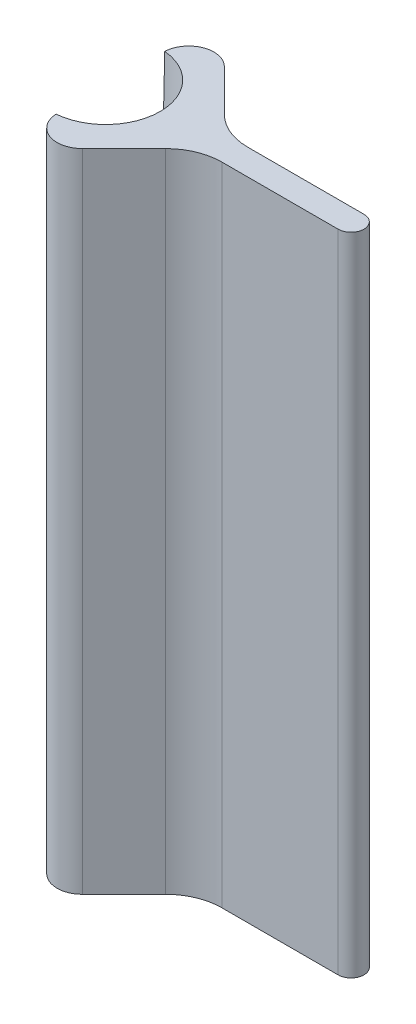
ISO-10303-21;
HEADER;
FILE_DESCRIPTION(('STEP AP214'),'2;1');
FILE_NAME('part.step','',(''),(''),'','','');
FILE_SCHEMA(('AUTOMOTIVE_DESIGN { 1 0 10303 214 1 1 1 1 }'));
ENDSEC;
DATA;
#1=APPLICATION_CONTEXT('core data for automotive mechanical design processes');
#2=APPLICATION_PROTOCOL_DEFINITION('international standard','automotive_design',2000,#1);
#3=PRODUCT_CONTEXT('',#1,'mechanical');
#4=PRODUCT('Part','Part','',(#3));
#5=PRODUCT_RELATED_PRODUCT_CATEGORY('part','',(#4));
#6=PRODUCT_DEFINITION_FORMATION('','',#4);
#7=PRODUCT_DEFINITION_CONTEXT('part definition',#1,'design');
#8=PRODUCT_DEFINITION('design','',#6,#7);
#9=PRODUCT_DEFINITION_SHAPE('','',#8);
#10=(LENGTH_UNIT() NAMED_UNIT(*) SI_UNIT(.MILLI.,.METRE.));
#11=(NAMED_UNIT(*) PLANE_ANGLE_UNIT() SI_UNIT($,.RADIAN.));
#12=(NAMED_UNIT(*) SI_UNIT($,.STERADIAN.) SOLID_ANGLE_UNIT());
#13=UNCERTAINTY_MEASURE_WITH_UNIT(LENGTH_MEASURE(1.E-05),#10,'distance_accuracy_value','');
#14=(GEOMETRIC_REPRESENTATION_CONTEXT(3) GLOBAL_UNCERTAINTY_ASSIGNED_CONTEXT((#13)) GLOBAL_UNIT_ASSIGNED_CONTEXT((#10,
#11,#12)) REPRESENTATION_CONTEXT('',''));
#15=CARTESIAN_POINT('',(0.,0.,0.));
#16=DIRECTION('',(0.,0.,1.));
#17=DIRECTION('',(1.,0.,0.));
#18=AXIS2_PLACEMENT_3D('',#15,#16,#17);
#19=CARTESIAN_POINT('',(3.8,10.,0.));
#20=DIRECTION('',(0.,-1.,0.));
#21=DIRECTION('',(0.,0.,-1.));
#22=AXIS2_PLACEMENT_3D('',#19,#20,#21);
#23=CYLINDRICAL_SURFACE('',#22,0.2);
#24=CARTESIAN_POINT('',(3.8,0.,0.));
#25=DIRECTION('',(0.,1.,0.));
#26=DIRECTION('',(0.,0.,1.));
#27=AXIS2_PLACEMENT_3D('',#24,#25,#26);
#28=CIRCLE('',#27,0.2);
#29=CARTESIAN_POINT('',(3.8,0.,-0.2));
#30=VERTEX_POINT('',#29);
#31=CARTESIAN_POINT('',(3.8,0.,0.2));
#32=VERTEX_POINT('',#31);
#33=EDGE_CURVE('E152',#30,#32,#28,.F.);
#34=ORIENTED_EDGE('',*,*,#33,.F.);
#35=DIRECTION('',(0.,-1.,0.));
#36=VECTOR('',#35,1.);
#37=CARTESIAN_POINT('',(3.8,10.,-0.2));
#38=LINE('',#37,#36);
#39=CARTESIAN_POINT('',(3.8,10.,-0.2));
#40=VERTEX_POINT('',#39);
#41=EDGE_CURVE('E11',#40,#30,#38,.T.);
#42=ORIENTED_EDGE('',*,*,#41,.F.);
#43=CARTESIAN_POINT('',(3.8,10.,0.));
#44=DIRECTION('',(0.,1.,0.));
#45=DIRECTION('',(0.,0.,1.));
#46=AXIS2_PLACEMENT_3D('',#43,#44,#45);
#47=CIRCLE('',#46,0.2);
#48=CARTESIAN_POINT('',(3.8,10.,0.2));
#49=VERTEX_POINT('',#48);
#50=EDGE_CURVE('E179',#40,#49,#47,.F.);
#51=ORIENTED_EDGE('',*,*,#50,.T.);
#52=DIRECTION('',(0.,-1.,0.));
#53=VECTOR('',#52,1.);
#54=CARTESIAN_POINT('',(3.8,10.,0.2));
#55=LINE('',#54,#53);
#56=EDGE_CURVE('E102',#49,#32,#55,.T.);
#57=ORIENTED_EDGE('',*,*,#56,.T.);
#58=EDGE_LOOP('',(#34,#42,#51,#57));
#59=FACE_BOUND('',#58,.T.);
#60=ADVANCED_FACE('F41',(#59),#23,.T.);
#61=CARTESIAN_POINT('',(0.,10.,-0.2));
#62=DIRECTION('',(0.,0.,-1.));
#63=DIRECTION('',(-1.,0.,0.));
#64=AXIS2_PLACEMENT_3D('',#61,#62,#63);
#65=PLANE('',#64);
#66=DIRECTION('',(1.,0.,0.));
#67=VECTOR('',#66,1.);
#68=CARTESIAN_POINT('',(0.,0.,-0.2));
#69=LINE('',#68,#67);
#70=CARTESIAN_POINT('',(2.,0.,-0.2));
#71=VERTEX_POINT('',#70);
#72=EDGE_CURVE('E155',#71,#30,#69,.T.);
#73=ORIENTED_EDGE('',*,*,#72,.F.);
#74=DIRECTION('',(0.,-1.,0.));
#75=VECTOR('',#74,1.);
#76=CARTESIAN_POINT('',(2.,10.,-0.2));
#77=LINE('',#76,#75);
#78=CARTESIAN_POINT('',(2.,10.,-0.2));
#79=VERTEX_POINT('',#78);
#80=EDGE_CURVE('E49',#79,#71,#77,.T.);
#81=ORIENTED_EDGE('',*,*,#80,.F.);
#82=DIRECTION('',(1.,0.,0.));
#83=VECTOR('',#82,1.);
#84=CARTESIAN_POINT('',(0.,10.,-0.2));
#85=LINE('',#84,#83);
#86=EDGE_CURVE('E214',#79,#40,#85,.T.);
#87=ORIENTED_EDGE('',*,*,#86,.T.);
#88=ORIENTED_EDGE('',*,*,#41,.T.);
#89=EDGE_LOOP('',(#73,#81,#87,#88));
#90=FACE_BOUND('',#89,.T.);
#91=ADVANCED_FACE('F201',(#90),#65,.T.);
#92=CARTESIAN_POINT('',(2.,10.,-1.07279220613579));
#93=DIRECTION('',(0.,-1.,0.));
#94=DIRECTION('',(0.,0.,-1.));
#95=AXIS2_PLACEMENT_3D('',#92,#93,#94);
#96=CYLINDRICAL_SURFACE('',#95,0.872792206135791);
#97=CARTESIAN_POINT('',(2.,0.,-1.07279220613579));
#98=DIRECTION('',(0.,1.,0.));
#99=DIRECTION('',(0.,0.,1.));
#100=AXIS2_PLACEMENT_3D('',#97,#98,#99);
#101=CIRCLE('',#100,0.872792206135791);
#102=CARTESIAN_POINT('',(1.38284271247461,0.,-0.455634918610408));
#103=VERTEX_POINT('',#102);
#104=EDGE_CURVE('E159',#103,#71,#101,.T.);
#105=ORIENTED_EDGE('',*,*,#104,.F.);
#106=DIRECTION('',(0.,-1.,0.));
#107=VECTOR('',#106,1.);
#108=CARTESIAN_POINT('',(1.38284271247461,10.,-0.455634918610408));
#109=LINE('',#108,#107);
#110=CARTESIAN_POINT('',(1.38284271247461,10.,-0.455634918610408));
#111=VERTEX_POINT('',#110);
#112=EDGE_CURVE('E190',#111,#103,#109,.T.);
#113=ORIENTED_EDGE('',*,*,#112,.F.);
#114=CARTESIAN_POINT('',(2.,10.,-1.07279220613579));
#115=DIRECTION('',(0.,1.,0.));
#116=DIRECTION('',(0.,0.,1.));
#117=AXIS2_PLACEMENT_3D('',#114,#115,#116);
#118=CIRCLE('',#117,0.872792206135791);
#119=EDGE_CURVE('E197',#111,#79,#118,.T.);
#120=ORIENTED_EDGE('',*,*,#119,.T.);
#121=ORIENTED_EDGE('',*,*,#80,.T.);
#122=EDGE_LOOP('',(#105,#113,#120,#121));
#123=FACE_BOUND('',#122,.T.);
#124=ADVANCED_FACE('F195',(#123),#96,.F.);
#125=CARTESIAN_POINT('',(0.919238815542513,10.,-0.91923881554251));
#126=DIRECTION('',(0.707106781186549,0.,-0.707106781186546));
#127=DIRECTION('',(-0.707106781186546,0.,-0.707106781186549));
#128=AXIS2_PLACEMENT_3D('',#125,#126,#127);
#129=PLANE('',#128);
#130=DIRECTION('',(0.707106781186546,0.,0.707106781186549));
#131=VECTOR('',#130,1.);
#132=CARTESIAN_POINT('',(0.919238815542513,0.,-0.91923881554251));
#133=LINE('',#132,#131);
#134=CARTESIAN_POINT('',(0.738477631085024,0.,-1.1));
#135=VERTEX_POINT('',#134);
#136=EDGE_CURVE('E162',#135,#103,#133,.T.);
#137=ORIENTED_EDGE('',*,*,#136,.F.);
#138=DIRECTION('',(0.,-1.,0.));
#139=VECTOR('',#138,1.);
#140=CARTESIAN_POINT('',(0.738477631085024,10.,-1.1));
#141=LINE('',#140,#139);
#142=CARTESIAN_POINT('',(0.738477631085024,10.,-1.1));
#143=VERTEX_POINT('',#142);
#144=EDGE_CURVE('E188',#143,#135,#141,.T.);
#145=ORIENTED_EDGE('',*,*,#144,.F.);
#146=DIRECTION('',(0.707106781186546,0.,0.707106781186549));
#147=VECTOR('',#146,1.);
#148=CARTESIAN_POINT('',(0.919238815542513,10.,-0.91923881554251));
#149=LINE('',#148,#147);
#150=EDGE_CURVE('E211',#143,#111,#149,.T.);
#151=ORIENTED_EDGE('',*,*,#150,.T.);
#152=ORIENTED_EDGE('',*,*,#112,.T.);
#153=EDGE_LOOP('',(#137,#145,#151,#152));
#154=FACE_BOUND('',#153,.T.);
#155=ADVANCED_FACE('F208',(#154),#129,.T.);
#156=CARTESIAN_POINT('',(0.463089493616225,10.,-0.824611862531202));
#157=DIRECTION('',(0.,-1.,0.));
#158=DIRECTION('',(0.,0.,-1.));
#159=AXIS2_PLACEMENT_3D('',#156,#157,#158);
#160=CYLINDRICAL_SURFACE('',#159,0.389457638925041);
#161=CARTESIAN_POINT('',(0.463089493616225,0.,-0.824611862531202));
#162=DIRECTION('',(0.,1.,0.));
#163=DIRECTION('',(0.,0.,1.));
#164=AXIS2_PLACEMENT_3D('',#161,#162,#163);
#165=CIRCLE('',#164,0.389457638925041);
#166=CARTESIAN_POINT('',(0.0751138585877696,0.,-0.858555332320462));
#167=VERTEX_POINT('',#166);
#168=EDGE_CURVE('E165',#167,#135,#165,.F.);
#169=ORIENTED_EDGE('',*,*,#168,.F.);
#170=DIRECTION('',(0.,-1.,0.));
#171=VECTOR('',#170,1.);
#172=CARTESIAN_POINT('',(0.0751138585877696,10.,-0.858555332320462));
#173=LINE('',#172,#171);
#174=CARTESIAN_POINT('',(0.0751138585877696,10.,-0.858555332320462));
#175=VERTEX_POINT('',#174);
#176=EDGE_CURVE('E186',#175,#167,#173,.T.);
#177=ORIENTED_EDGE('',*,*,#176,.F.);
#178=CARTESIAN_POINT('',(0.463089493616225,10.,-0.824611862531202));
#179=DIRECTION('',(0.,1.,0.));
#180=DIRECTION('',(0.,0.,1.));
#181=AXIS2_PLACEMENT_3D('',#178,#179,#180);
#182=CIRCLE('',#181,0.389457638925041);
#183=EDGE_CURVE('E216',#175,#143,#182,.F.);
#184=ORIENTED_EDGE('',*,*,#183,.T.);
#185=ORIENTED_EDGE('',*,*,#144,.T.);
#186=EDGE_LOOP('',(#169,#177,#184,#185));
#187=FACE_BOUND('',#186,.T.);
#188=ADVANCED_FACE('F259',(#187),#160,.T.);
#189=CARTESIAN_POINT('',(0.,10.,0.));
#190=DIRECTION('',(-0.996194698091746,0.,-0.0871557427476545));
#191=DIRECTION('',(-0.0871557427476545,0.,0.996194698091746));
#192=AXIS2_PLACEMENT_3D('',#189,#190,#191);
#193=PLANE('',#192);
#194=DIRECTION('',(-0.00182525215986723,-0.999780683474846,0.0208627276530114));
#195=VECTOR('',#194,1.);
#196=CARTESIAN_POINT('',(0.,-30.3145833930611,0.));
#197=LINE('',#196,#195);
#198=CARTESIAN_POINT('',(0.0553438966447606,0.,-0.632583633288259));
#199=VERTEX_POINT('',#198);
#200=CARTESIAN_POINT('',(0.0736004222011793,10.,-0.841256675264832));
#201=VERTEX_POINT('',#200);
#202=EDGE_CURVE('E243',#199,#201,#197,.F.);
#203=ORIENTED_EDGE('',*,*,#202,.T.);
#204=DIRECTION('',(0.0871557427476545,0.,-0.996194698091746));
#205=VECTOR('',#204,1.);
#206=CARTESIAN_POINT('',(0.,10.,0.));
#207=LINE('',#206,#205);
#208=EDGE_CURVE('E222',#201,#175,#207,.T.);
#209=ORIENTED_EDGE('',*,*,#208,.T.);
#210=ORIENTED_EDGE('',*,*,#176,.T.);
#211=DIRECTION('',(0.0871557427476545,0.,-0.996194698091746));
#212=VECTOR('',#211,1.);
#213=CARTESIAN_POINT('',(0.,0.,0.));
#214=LINE('',#213,#212);
#215=EDGE_CURVE('E168',#199,#167,#214,.T.);
#216=ORIENTED_EDGE('',*,*,#215,.F.);
#217=EDGE_LOOP('',(#203,#209,#210,#216));
#218=FACE_BOUND('',#217,.T.);
#219=ADVANCED_FACE('F256',(#218),#193,.T.);
#220=CARTESIAN_POINT('',(0.,10.,0.));
#221=DIRECTION('',(0.996194698091746,0.,-0.0871557427476545));
#222=DIRECTION('',(-0.0871557427476545,0.,-0.996194698091746));
#223=AXIS2_PLACEMENT_3D('',#220,#221,#222);
#224=PLANE('',#223);
#225=DIRECTION('',(0.0871557427476545,0.,0.996194698091746));
#226=VECTOR('',#225,1.);
#227=CARTESIAN_POINT('',(0.,10.,0.));
#228=LINE('',#227,#226);
#229=CARTESIAN_POINT('',(0.0736004222011793,10.,0.841256675264832));
#230=VERTEX_POINT('',#229);
#231=CARTESIAN_POINT('',(0.0751138585877696,10.,0.858555332320462));
#232=VERTEX_POINT('',#231);
#233=EDGE_CURVE('E224',#230,#232,#228,.T.);
#234=ORIENTED_EDGE('',*,*,#233,.F.);
#235=DIRECTION('',(-0.00182525215986723,-0.999780683474846,-0.0208627276530114));
#236=VECTOR('',#235,1.);
#237=CARTESIAN_POINT('',(0.,-30.3145833930611,0.));
#238=LINE('',#237,#236);
#239=CARTESIAN_POINT('',(0.0553438966447606,0.,0.632583633288259));
#240=VERTEX_POINT('',#239);
#241=EDGE_CURVE('E246',#240,#230,#238,.F.);
#242=ORIENTED_EDGE('',*,*,#241,.F.);
#243=DIRECTION('',(0.0871557427476545,0.,0.996194698091746));
#244=VECTOR('',#243,1.);
#245=CARTESIAN_POINT('',(0.,0.,0.));
#246=LINE('',#245,#244);
#247=CARTESIAN_POINT('',(0.0751138585877696,0.,0.858555332320462));
#248=VERTEX_POINT('',#247);
#249=EDGE_CURVE('E171',#240,#248,#246,.T.);
#250=ORIENTED_EDGE('',*,*,#249,.T.);
#251=DIRECTION('',(0.,-1.,0.));
#252=VECTOR('',#251,1.);
#253=CARTESIAN_POINT('',(0.0751138585877696,10.,0.858555332320462));
#254=LINE('',#253,#252);
#255=EDGE_CURVE('E183',#232,#248,#254,.T.);
#256=ORIENTED_EDGE('',*,*,#255,.F.);
#257=EDGE_LOOP('',(#234,#242,#250,#256));
#258=FACE_BOUND('',#257,.T.);
#259=ADVANCED_FACE('F231',(#258),#224,.F.);
#260=CARTESIAN_POINT('',(0.463089493616225,10.,0.824611862531202));
#261=DIRECTION('',(0.,-1.,0.));
#262=DIRECTION('',(0.,0.,-1.));
#263=AXIS2_PLACEMENT_3D('',#260,#261,#262);
#264=CYLINDRICAL_SURFACE('',#263,0.389457638925041);
#265=CARTESIAN_POINT('',(0.463089493616225,0.,0.824611862531202));
#266=DIRECTION('',(0.,1.,0.));
#267=DIRECTION('',(0.,0.,1.));
#268=AXIS2_PLACEMENT_3D('',#265,#266,#267);
#269=CIRCLE('',#268,0.389457638925041);
#270=CARTESIAN_POINT('',(0.738477631085025,0.,1.1));
#271=VERTEX_POINT('',#270);
#272=EDGE_CURVE('E173',#248,#271,#269,.T.);
#273=ORIENTED_EDGE('',*,*,#272,.T.);
#274=DIRECTION('',(0.,-1.,0.));
#275=VECTOR('',#274,1.);
#276=CARTESIAN_POINT('',(0.738477631085025,10.,1.1));
#277=LINE('',#276,#275);
#278=CARTESIAN_POINT('',(0.738477631085025,10.,1.1));
#279=VERTEX_POINT('',#278);
#280=EDGE_CURVE('E144',#279,#271,#277,.T.);
#281=ORIENTED_EDGE('',*,*,#280,.F.);
#282=CARTESIAN_POINT('',(0.463089493616225,10.,0.824611862531202));
#283=DIRECTION('',(0.,1.,0.));
#284=DIRECTION('',(0.,0.,1.));
#285=AXIS2_PLACEMENT_3D('',#282,#283,#284);
#286=CIRCLE('',#285,0.389457638925041);
#287=EDGE_CURVE('E135',#232,#279,#286,.T.);
#288=ORIENTED_EDGE('',*,*,#287,.F.);
#289=ORIENTED_EDGE('',*,*,#255,.T.);
#290=EDGE_LOOP('',(#273,#281,#288,#289));
#291=FACE_BOUND('',#290,.T.);
#292=ADVANCED_FACE('F234',(#291),#264,.T.);
#293=CARTESIAN_POINT('',(0.919238815542514,10.,0.91923881554251));
#294=DIRECTION('',(-0.707106781186549,0.,-0.707106781186546));
#295=DIRECTION('',(-0.707106781186546,0.,0.707106781186549));
#296=AXIS2_PLACEMENT_3D('',#293,#294,#295);
#297=PLANE('',#296);
#298=DIRECTION('',(0.707106781186546,0.,-0.707106781186549));
#299=VECTOR('',#298,1.);
#300=CARTESIAN_POINT('',(0.919238815542514,0.,0.91923881554251));
#301=LINE('',#300,#299);
#302=CARTESIAN_POINT('',(1.38284271247461,0.,0.455634918610408));
#303=VERTEX_POINT('',#302);
#304=EDGE_CURVE('E143',#271,#303,#301,.T.);
#305=ORIENTED_EDGE('',*,*,#304,.T.);
#306=DIRECTION('',(0.,-1.,0.));
#307=VECTOR('',#306,1.);
#308=CARTESIAN_POINT('',(1.38284271247461,10.,0.455634918610408));
#309=LINE('',#308,#307);
#310=CARTESIAN_POINT('',(1.38284271247461,10.,0.455634918610408));
#311=VERTEX_POINT('',#310);
#312=EDGE_CURVE('E140',#311,#303,#309,.T.);
#313=ORIENTED_EDGE('',*,*,#312,.F.);
#314=DIRECTION('',(0.707106781186546,0.,-0.707106781186549));
#315=VECTOR('',#314,1.);
#316=CARTESIAN_POINT('',(0.919238815542514,10.,0.91923881554251));
#317=LINE('',#316,#315);
#318=EDGE_CURVE('E128',#279,#311,#317,.T.);
#319=ORIENTED_EDGE('',*,*,#318,.F.);
#320=ORIENTED_EDGE('',*,*,#280,.T.);
#321=EDGE_LOOP('',(#305,#313,#319,#320));
#322=FACE_BOUND('',#321,.T.);
#323=ADVANCED_FACE('F141',(#322),#297,.F.);
#324=CARTESIAN_POINT('',(2.,10.,1.07279220613579));
#325=DIRECTION('',(0.,-1.,0.));
#326=DIRECTION('',(0.,0.,-1.));
#327=AXIS2_PLACEMENT_3D('',#324,#325,#326);
#328=CYLINDRICAL_SURFACE('',#327,0.872792206135791);
#329=CARTESIAN_POINT('',(2.,0.,1.07279220613579));
#330=DIRECTION('',(0.,1.,0.));
#331=DIRECTION('',(0.,0.,1.));
#332=AXIS2_PLACEMENT_3D('',#329,#330,#331);
#333=CIRCLE('',#332,0.872792206135791);
#334=CARTESIAN_POINT('',(2.,0.,0.2));
#335=VERTEX_POINT('',#334);
#336=EDGE_CURVE('E95',#303,#335,#333,.F.);
#337=ORIENTED_EDGE('',*,*,#336,.T.);
#338=DIRECTION('',(0.,-1.,0.));
#339=VECTOR('',#338,1.);
#340=CARTESIAN_POINT('',(2.,10.,0.2));
#341=LINE('',#340,#339);
#342=CARTESIAN_POINT('',(2.,10.,0.2));
#343=VERTEX_POINT('',#342);
#344=EDGE_CURVE('E145',#343,#335,#341,.T.);
#345=ORIENTED_EDGE('',*,*,#344,.F.);
#346=CARTESIAN_POINT('',(2.,10.,1.07279220613579));
#347=DIRECTION('',(0.,1.,0.));
#348=DIRECTION('',(0.,0.,1.));
#349=AXIS2_PLACEMENT_3D('',#346,#347,#348);
#350=CIRCLE('',#349,0.872792206135791);
#351=EDGE_CURVE('E133',#311,#343,#350,.F.);
#352=ORIENTED_EDGE('',*,*,#351,.F.);
#353=ORIENTED_EDGE('',*,*,#312,.T.);
#354=EDGE_LOOP('',(#337,#345,#352,#353));
#355=FACE_BOUND('',#354,.T.);
#356=ADVANCED_FACE('F147',(#355),#328,.F.);
#357=CARTESIAN_POINT('',(0.,10.,0.2));
#358=DIRECTION('',(0.,0.,-1.));
#359=DIRECTION('',(-1.,0.,0.));
#360=AXIS2_PLACEMENT_3D('',#357,#358,#359);
#361=PLANE('',#360);
#362=DIRECTION('',(1.,0.,0.));
#363=VECTOR('',#362,1.);
#364=CARTESIAN_POINT('',(0.,0.,0.2));
#365=LINE('',#364,#363);
#366=EDGE_CURVE('E177',#335,#32,#365,.T.);
#367=ORIENTED_EDGE('',*,*,#366,.T.);
#368=ORIENTED_EDGE('',*,*,#56,.F.);
#369=DIRECTION('',(1.,0.,0.));
#370=VECTOR('',#369,1.);
#371=CARTESIAN_POINT('',(0.,10.,0.2));
#372=LINE('',#371,#370);
#373=EDGE_CURVE('E57',#343,#49,#372,.T.);
#374=ORIENTED_EDGE('',*,*,#373,.F.);
#375=ORIENTED_EDGE('',*,*,#344,.T.);
#376=EDGE_LOOP('',(#367,#368,#374,#375));
#377=FACE_BOUND('',#376,.T.);
#378=ADVANCED_FACE('F237',(#377),#361,.F.);
#379=CARTESIAN_POINT('',(0.,10.,0.));
#380=DIRECTION('',(0.,1.,0.));
#381=DIRECTION('',(0.,0.,1.));
#382=AXIS2_PLACEMENT_3D('',#379,#380,#381);
#383=PLANE('',#382);
#384=CARTESIAN_POINT('',(0.,10.,0.));
#385=DIRECTION('',(0.,1.,0.));
#386=DIRECTION('',(0.,0.,1.));
#387=AXIS2_PLACEMENT_3D('',#384,#385,#386);
#388=CIRCLE('',#387,0.8444701390966);
#389=EDGE_CURVE('E156',#201,#230,#388,.F.);
#390=ORIENTED_EDGE('',*,*,#389,.T.);
#391=ORIENTED_EDGE('',*,*,#233,.T.);
#392=ORIENTED_EDGE('',*,*,#287,.T.);
#393=ORIENTED_EDGE('',*,*,#318,.T.);
#394=ORIENTED_EDGE('',*,*,#351,.T.);
#395=ORIENTED_EDGE('',*,*,#373,.T.);
#396=ORIENTED_EDGE('',*,*,#50,.F.);
#397=ORIENTED_EDGE('',*,*,#86,.F.);
#398=ORIENTED_EDGE('',*,*,#119,.F.);
#399=ORIENTED_EDGE('',*,*,#150,.F.);
#400=ORIENTED_EDGE('',*,*,#183,.F.);
#401=ORIENTED_EDGE('',*,*,#208,.F.);
#402=EDGE_LOOP('',(#390,#391,#392,#393,#394,#395,#396,#397,#398,#399,#400,#401));
#403=FACE_BOUND('',#402,.T.);
#404=ADVANCED_FACE('F131',(#403),#383,.T.);
#405=CARTESIAN_POINT('',(0.,0.,0.));
#406=DIRECTION('',(0.,1.,0.));
#407=DIRECTION('',(0.,0.,1.));
#408=AXIS2_PLACEMENT_3D('',#405,#406,#407);
#409=PLANE('',#408);
#410=ORIENTED_EDGE('',*,*,#249,.F.);
#411=CARTESIAN_POINT('',(0.,0.,0.));
#412=DIRECTION('',(0.,-1.,0.));
#413=DIRECTION('',(0.,0.,-1.));
#414=AXIS2_PLACEMENT_3D('',#411,#412,#413);
#415=CIRCLE('',#414,0.635);
#416=EDGE_CURVE('E240',#199,#240,#415,.T.);
#417=ORIENTED_EDGE('',*,*,#416,.F.);
#418=ORIENTED_EDGE('',*,*,#215,.T.);
#419=ORIENTED_EDGE('',*,*,#168,.T.);
#420=ORIENTED_EDGE('',*,*,#136,.T.);
#421=ORIENTED_EDGE('',*,*,#104,.T.);
#422=ORIENTED_EDGE('',*,*,#72,.T.);
#423=ORIENTED_EDGE('',*,*,#33,.T.);
#424=ORIENTED_EDGE('',*,*,#366,.F.);
#425=ORIENTED_EDGE('',*,*,#336,.F.);
#426=ORIENTED_EDGE('',*,*,#304,.F.);
#427=ORIENTED_EDGE('',*,*,#272,.F.);
#428=EDGE_LOOP('',(#410,#417,#418,#419,#420,#421,#422,#423,#424,#425,#426,#427));
#429=FACE_BOUND('',#428,.T.);
#430=ADVANCED_FACE('F204',(#429),#409,.F.);
#431=CARTESIAN_POINT('',(0.,0.,0.));
#432=DIRECTION('',(0.,1.,0.));
#433=DIRECTION('',(0.,0.,-1.));
#434=AXIS2_PLACEMENT_3D('',#431,#432,#433);
#435=CONICAL_SURFACE('',#434,0.635,0.020943951023932);
#436=ORIENTED_EDGE('',*,*,#416,.T.);
#437=ORIENTED_EDGE('',*,*,#241,.T.);
#438=ORIENTED_EDGE('',*,*,#389,.F.);
#439=ORIENTED_EDGE('',*,*,#202,.F.);
#440=EDGE_LOOP('',(#436,#437,#438,#439));
#441=FACE_BOUND('',#440,.T.);
#442=ADVANCED_FACE('F249',(#441),#435,.F.);
#443=CLOSED_SHELL('',(#60,#91,#124,#155,#188,#219,#259,#292,#323,#356,#378,#404,#430,#442));
#444=MANIFOLD_SOLID_BREP('B2',#443);
#445=ADVANCED_BREP_SHAPE_REPRESENTATION('',(#18,#444),#14);
#446=SHAPE_DEFINITION_REPRESENTATION(#9,#445);
ENDSEC;
END-ISO-10303-21;
